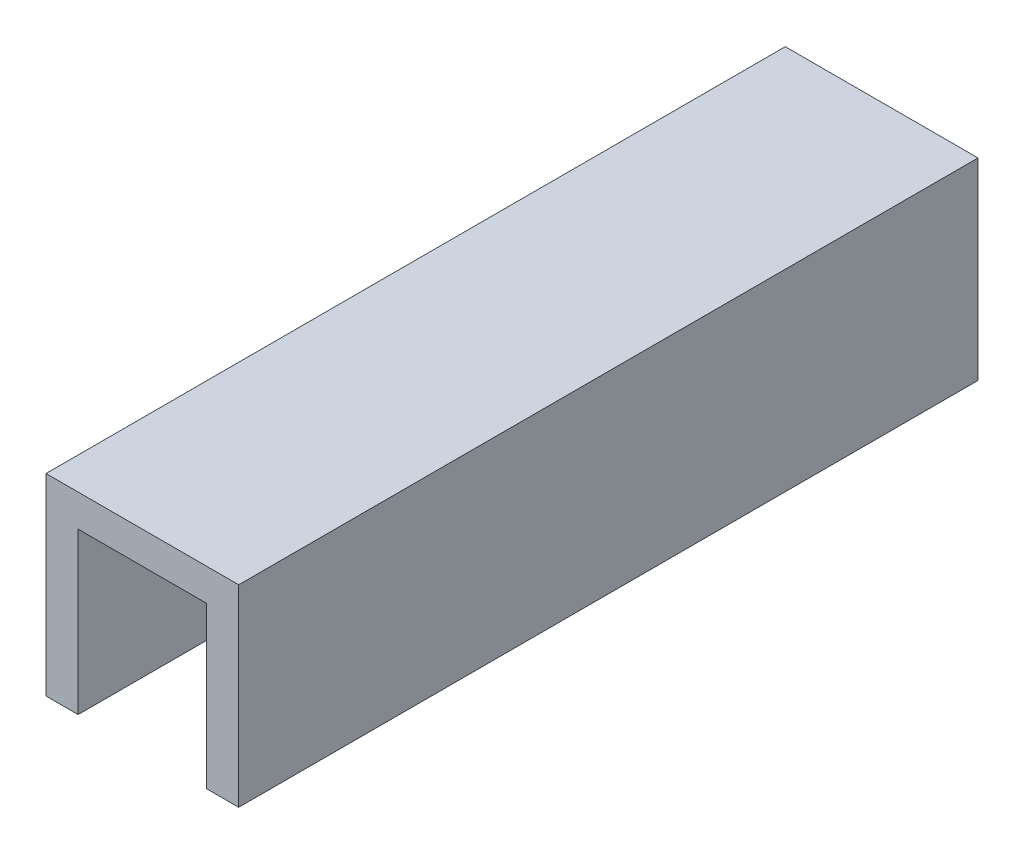
ISO-10303-21;
HEADER;
FILE_DESCRIPTION(('STEP AP214'),'2;1');
FILE_NAME('part.step','',(''),(''),'','','');
FILE_SCHEMA(('AUTOMOTIVE_DESIGN { 1 0 10303 214 1 1 1 1 }'));
ENDSEC;
DATA;
#1=APPLICATION_CONTEXT('core data for automotive mechanical design processes');
#2=APPLICATION_PROTOCOL_DEFINITION('international standard','automotive_design',2000,#1);
#3=PRODUCT_CONTEXT('',#1,'mechanical');
#4=PRODUCT('Part','Part','',(#3));
#5=PRODUCT_RELATED_PRODUCT_CATEGORY('part','',(#4));
#6=PRODUCT_DEFINITION_FORMATION('','',#4);
#7=PRODUCT_DEFINITION_CONTEXT('part definition',#1,'design');
#8=PRODUCT_DEFINITION('design','',#6,#7);
#9=PRODUCT_DEFINITION_SHAPE('','',#8);
#10=(LENGTH_UNIT() NAMED_UNIT(*) SI_UNIT(.MILLI.,.METRE.));
#11=(NAMED_UNIT(*) PLANE_ANGLE_UNIT() SI_UNIT($,.RADIAN.));
#12=(NAMED_UNIT(*) SI_UNIT($,.STERADIAN.) SOLID_ANGLE_UNIT());
#13=UNCERTAINTY_MEASURE_WITH_UNIT(LENGTH_MEASURE(1.E-05),#10,'distance_accuracy_value','');
#14=(GEOMETRIC_REPRESENTATION_CONTEXT(3) GLOBAL_UNCERTAINTY_ASSIGNED_CONTEXT((#13)) GLOBAL_UNIT_ASSIGNED_CONTEXT((#10,
#11,#12)) REPRESENTATION_CONTEXT('',''));
#15=CARTESIAN_POINT('',(0.,0.,0.));
#16=DIRECTION('',(0.,0.,1.));
#17=DIRECTION('',(1.,0.,0.));
#18=AXIS2_PLACEMENT_3D('',#15,#16,#17);
#19=CARTESIAN_POINT('',(0.,0.,0.));
#20=DIRECTION('',(0.,0.,-1.));
#21=DIRECTION('',(-1.,0.,0.));
#22=AXIS2_PLACEMENT_3D('',#19,#20,#21);
#23=PLANE('',#22);
#24=DIRECTION('',(0.,1.,0.));
#25=VECTOR('',#24,1.);
#26=CARTESIAN_POINT('',(0.,-7.9375,0.));
#27=LINE('',#26,#25);
#28=CARTESIAN_POINT('',(0.,-7.9375,0.));
#29=VERTEX_POINT('',#28);
#30=CARTESIAN_POINT('',(0.,0.,0.));
#31=VERTEX_POINT('',#30);
#32=EDGE_CURVE('E110',#29,#31,#27,.T.);
#33=ORIENTED_EDGE('',*,*,#32,.F.);
#34=DIRECTION('',(1.,0.,0.));
#35=VECTOR('',#34,1.);
#36=CARTESIAN_POINT('',(-1.5875,-7.9375,0.));
#37=LINE('',#36,#35);
#38=CARTESIAN_POINT('',(-1.5875,-7.9375,0.));
#39=VERTEX_POINT('',#38);
#40=EDGE_CURVE('E74',#39,#29,#37,.T.);
#41=ORIENTED_EDGE('',*,*,#40,.F.);
#42=DIRECTION('',(0.,-1.,0.));
#43=VECTOR('',#42,1.);
#44=CARTESIAN_POINT('',(-1.5875,1.5875,0.));
#45=LINE('',#44,#43);
#46=CARTESIAN_POINT('',(-1.5875,1.5875,0.));
#47=VERTEX_POINT('',#46);
#48=EDGE_CURVE('E80',#47,#39,#45,.T.);
#49=ORIENTED_EDGE('',*,*,#48,.F.);
#50=DIRECTION('',(-1.,0.,0.));
#51=VECTOR('',#50,1.);
#52=CARTESIAN_POINT('',(7.9375,1.5875,0.));
#53=LINE('',#52,#51);
#54=CARTESIAN_POINT('',(7.9375,1.5875,0.));
#55=VERTEX_POINT('',#54);
#56=EDGE_CURVE('E85',#55,#47,#53,.T.);
#57=ORIENTED_EDGE('',*,*,#56,.F.);
#58=DIRECTION('',(0.,1.,0.));
#59=VECTOR('',#58,1.);
#60=CARTESIAN_POINT('',(7.9375,-7.9375,0.));
#61=LINE('',#60,#59);
#62=CARTESIAN_POINT('',(7.9375,-7.9375,0.));
#63=VERTEX_POINT('',#62);
#64=EDGE_CURVE('E150',#63,#55,#61,.T.);
#65=ORIENTED_EDGE('',*,*,#64,.F.);
#66=DIRECTION('',(1.,0.,0.));
#67=VECTOR('',#66,1.);
#68=CARTESIAN_POINT('',(6.35,-7.9375,0.));
#69=LINE('',#68,#67);
#70=CARTESIAN_POINT('',(6.35,-7.9375,0.));
#71=VERTEX_POINT('',#70);
#72=EDGE_CURVE('E142',#71,#63,#69,.T.);
#73=ORIENTED_EDGE('',*,*,#72,.F.);
#74=DIRECTION('',(0.,-1.,0.));
#75=VECTOR('',#74,1.);
#76=CARTESIAN_POINT('',(6.35,0.,0.));
#77=LINE('',#76,#75);
#78=CARTESIAN_POINT('',(6.35,0.,0.));
#79=VERTEX_POINT('',#78);
#80=EDGE_CURVE('E133',#79,#71,#77,.T.);
#81=ORIENTED_EDGE('',*,*,#80,.F.);
#82=DIRECTION('',(1.,0.,0.));
#83=VECTOR('',#82,1.);
#84=CARTESIAN_POINT('',(0.,0.,0.));
#85=LINE('',#84,#83);
#86=EDGE_CURVE('E112',#31,#79,#85,.T.);
#87=ORIENTED_EDGE('',*,*,#86,.F.);
#88=EDGE_LOOP('',(#33,#41,#49,#57,#65,#73,#81,#87));
#89=FACE_BOUND('',#88,.T.);
#90=ADVANCED_FACE('F43',(#89),#23,.T.);
#91=CARTESIAN_POINT('',(0.,0.,36.5379));
#92=DIRECTION('',(0.,0.,-1.));
#93=DIRECTION('',(-1.,0.,0.));
#94=AXIS2_PLACEMENT_3D('',#91,#92,#93);
#95=PLANE('',#94);
#96=DIRECTION('',(0.,1.,0.));
#97=VECTOR('',#96,1.);
#98=CARTESIAN_POINT('',(0.,-7.93750000000001,36.5379));
#99=LINE('',#98,#97);
#100=CARTESIAN_POINT('',(0.,-7.93750000000001,36.5379));
#101=VERTEX_POINT('',#100);
#102=CARTESIAN_POINT('',(0.,0.,36.5379));
#103=VERTEX_POINT('',#102);
#104=EDGE_CURVE('E126',#101,#103,#99,.T.);
#105=ORIENTED_EDGE('',*,*,#104,.T.);
#106=DIRECTION('',(1.,0.,0.));
#107=VECTOR('',#106,1.);
#108=CARTESIAN_POINT('',(0.,0.,36.5379));
#109=LINE('',#108,#107);
#110=CARTESIAN_POINT('',(6.35,0.,36.5379));
#111=VERTEX_POINT('',#110);
#112=EDGE_CURVE('E134',#103,#111,#109,.T.);
#113=ORIENTED_EDGE('',*,*,#112,.T.);
#114=DIRECTION('',(0.,-1.,0.));
#115=VECTOR('',#114,1.);
#116=CARTESIAN_POINT('',(6.35,0.,36.5379));
#117=LINE('',#116,#115);
#118=CARTESIAN_POINT('',(6.35,-7.93750000000001,36.5379));
#119=VERTEX_POINT('',#118);
#120=EDGE_CURVE('E139',#111,#119,#117,.T.);
#121=ORIENTED_EDGE('',*,*,#120,.T.);
#122=DIRECTION('',(1.,0.,0.));
#123=VECTOR('',#122,1.);
#124=CARTESIAN_POINT('',(6.35,-7.93750000000001,36.5379));
#125=LINE('',#124,#123);
#126=CARTESIAN_POINT('',(7.9375,-7.93750000000001,36.5379));
#127=VERTEX_POINT('',#126);
#128=EDGE_CURVE('E147',#119,#127,#125,.T.);
#129=ORIENTED_EDGE('',*,*,#128,.T.);
#130=DIRECTION('',(0.,1.,0.));
#131=VECTOR('',#130,1.);
#132=CARTESIAN_POINT('',(7.9375,-7.93750000000001,36.5379));
#133=LINE('',#132,#131);
#134=CARTESIAN_POINT('',(7.9375,1.5875,36.5379));
#135=VERTEX_POINT('',#134);
#136=EDGE_CURVE('E155',#127,#135,#133,.T.);
#137=ORIENTED_EDGE('',*,*,#136,.T.);
#138=DIRECTION('',(-1.,0.,0.));
#139=VECTOR('',#138,1.);
#140=CARTESIAN_POINT('',(7.9375,1.5875,36.5379));
#141=LINE('',#140,#139);
#142=CARTESIAN_POINT('',(-1.5875,1.5875,36.5379));
#143=VERTEX_POINT('',#142);
#144=EDGE_CURVE('E62',#135,#143,#141,.T.);
#145=ORIENTED_EDGE('',*,*,#144,.T.);
#146=DIRECTION('',(0.,-1.,0.));
#147=VECTOR('',#146,1.);
#148=CARTESIAN_POINT('',(-1.5875,1.5875,36.5379));
#149=LINE('',#148,#147);
#150=CARTESIAN_POINT('',(-1.5875,-7.93750000000001,36.5379));
#151=VERTEX_POINT('',#150);
#152=EDGE_CURVE('E56',#143,#151,#149,.T.);
#153=ORIENTED_EDGE('',*,*,#152,.T.);
#154=DIRECTION('',(1.,0.,0.));
#155=VECTOR('',#154,1.);
#156=CARTESIAN_POINT('',(-1.5875,-7.93750000000001,36.5379));
#157=LINE('',#156,#155);
#158=EDGE_CURVE('E11',#151,#101,#157,.T.);
#159=ORIENTED_EDGE('',*,*,#158,.T.);
#160=EDGE_LOOP('',(#105,#113,#121,#129,#137,#145,#153,#159));
#161=FACE_BOUND('',#160,.T.);
#162=ADVANCED_FACE('F189',(#161),#95,.F.);
#163=CARTESIAN_POINT('',(0.,-7.9375,0.));
#164=DIRECTION('',(1.,0.,0.));
#165=DIRECTION('',(0.,0.,-1.));
#166=AXIS2_PLACEMENT_3D('',#163,#164,#165);
#167=PLANE('',#166);
#168=DIRECTION('',(0.,0.,1.));
#169=VECTOR('',#168,1.);
#170=CARTESIAN_POINT('',(0.,0.,0.));
#171=LINE('',#170,#169);
#172=EDGE_CURVE('E128',#31,#103,#171,.T.);
#173=ORIENTED_EDGE('',*,*,#172,.T.);
#174=ORIENTED_EDGE('',*,*,#104,.F.);
#175=DIRECTION('',(0.,0.,1.));
#176=VECTOR('',#175,1.);
#177=CARTESIAN_POINT('',(0.,-7.9375,0.));
#178=LINE('',#177,#176);
#179=EDGE_CURVE('E122',#29,#101,#178,.T.);
#180=ORIENTED_EDGE('',*,*,#179,.F.);
#181=ORIENTED_EDGE('',*,*,#32,.T.);
#182=EDGE_LOOP('',(#173,#174,#180,#181));
#183=FACE_BOUND('',#182,.T.);
#184=ADVANCED_FACE('F125',(#183),#167,.T.);
#185=CARTESIAN_POINT('',(0.,0.,0.));
#186=DIRECTION('',(0.,-1.,0.));
#187=DIRECTION('',(0.,0.,-1.));
#188=AXIS2_PLACEMENT_3D('',#185,#186,#187);
#189=PLANE('',#188);
#190=DIRECTION('',(0.,0.,1.));
#191=VECTOR('',#190,1.);
#192=CARTESIAN_POINT('',(6.35,0.,0.));
#193=LINE('',#192,#191);
#194=EDGE_CURVE('E136',#79,#111,#193,.T.);
#195=ORIENTED_EDGE('',*,*,#194,.T.);
#196=ORIENTED_EDGE('',*,*,#112,.F.);
#197=ORIENTED_EDGE('',*,*,#172,.F.);
#198=ORIENTED_EDGE('',*,*,#86,.T.);
#199=EDGE_LOOP('',(#195,#196,#197,#198));
#200=FACE_BOUND('',#199,.T.);
#201=ADVANCED_FACE('F187',(#200),#189,.T.);
#202=CARTESIAN_POINT('',(6.35,0.,0.));
#203=DIRECTION('',(-1.,0.,0.));
#204=DIRECTION('',(0.,-1.,0.));
#205=AXIS2_PLACEMENT_3D('',#202,#203,#204);
#206=PLANE('',#205);
#207=DIRECTION('',(0.,0.,1.));
#208=VECTOR('',#207,1.);
#209=CARTESIAN_POINT('',(6.35,-7.9375,0.));
#210=LINE('',#209,#208);
#211=EDGE_CURVE('E144',#71,#119,#210,.T.);
#212=ORIENTED_EDGE('',*,*,#211,.T.);
#213=ORIENTED_EDGE('',*,*,#120,.F.);
#214=ORIENTED_EDGE('',*,*,#194,.F.);
#215=ORIENTED_EDGE('',*,*,#80,.T.);
#216=EDGE_LOOP('',(#212,#213,#214,#215));
#217=FACE_BOUND('',#216,.T.);
#218=ADVANCED_FACE('F184',(#217),#206,.T.);
#219=CARTESIAN_POINT('',(6.35,-7.9375,0.));
#220=DIRECTION('',(0.,-1.,0.));
#221=DIRECTION('',(0.,0.,-1.));
#222=AXIS2_PLACEMENT_3D('',#219,#220,#221);
#223=PLANE('',#222);
#224=DIRECTION('',(0.,0.,1.));
#225=VECTOR('',#224,1.);
#226=CARTESIAN_POINT('',(7.9375,-7.9375,0.));
#227=LINE('',#226,#225);
#228=EDGE_CURVE('E152',#63,#127,#227,.T.);
#229=ORIENTED_EDGE('',*,*,#228,.T.);
#230=ORIENTED_EDGE('',*,*,#128,.F.);
#231=ORIENTED_EDGE('',*,*,#211,.F.);
#232=ORIENTED_EDGE('',*,*,#72,.T.);
#233=EDGE_LOOP('',(#229,#230,#231,#232));
#234=FACE_BOUND('',#233,.T.);
#235=ADVANCED_FACE('F180',(#234),#223,.T.);
#236=CARTESIAN_POINT('',(7.9375,-7.9375,0.));
#237=DIRECTION('',(1.,0.,0.));
#238=DIRECTION('',(0.,0.,-1.));
#239=AXIS2_PLACEMENT_3D('',#236,#237,#238);
#240=PLANE('',#239);
#241=DIRECTION('',(0.,0.,1.));
#242=VECTOR('',#241,1.);
#243=CARTESIAN_POINT('',(7.9375,1.5875,0.));
#244=LINE('',#243,#242);
#245=EDGE_CURVE('E158',#55,#135,#244,.T.);
#246=ORIENTED_EDGE('',*,*,#245,.T.);
#247=ORIENTED_EDGE('',*,*,#136,.F.);
#248=ORIENTED_EDGE('',*,*,#228,.F.);
#249=ORIENTED_EDGE('',*,*,#64,.T.);
#250=EDGE_LOOP('',(#246,#247,#248,#249));
#251=FACE_BOUND('',#250,.T.);
#252=ADVANCED_FACE('F176',(#251),#240,.T.);
#253=CARTESIAN_POINT('',(7.9375,1.5875,0.));
#254=DIRECTION('',(0.,1.,0.));
#255=DIRECTION('',(0.,0.,1.));
#256=AXIS2_PLACEMENT_3D('',#253,#254,#255);
#257=PLANE('',#256);
#258=DIRECTION('',(0.,0.,1.));
#259=VECTOR('',#258,1.);
#260=CARTESIAN_POINT('',(-1.5875,1.5875,0.));
#261=LINE('',#260,#259);
#262=EDGE_CURVE('E163',#47,#143,#261,.T.);
#263=ORIENTED_EDGE('',*,*,#262,.T.);
#264=ORIENTED_EDGE('',*,*,#144,.F.);
#265=ORIENTED_EDGE('',*,*,#245,.F.);
#266=ORIENTED_EDGE('',*,*,#56,.T.);
#267=EDGE_LOOP('',(#263,#264,#265,#266));
#268=FACE_BOUND('',#267,.T.);
#269=ADVANCED_FACE('F172',(#268),#257,.T.);
#270=CARTESIAN_POINT('',(-1.5875,1.5875,0.));
#271=DIRECTION('',(-1.,0.,0.));
#272=DIRECTION('',(0.,0.,1.));
#273=AXIS2_PLACEMENT_3D('',#270,#271,#272);
#274=PLANE('',#273);
#275=DIRECTION('',(0.,0.,1.));
#276=VECTOR('',#275,1.);
#277=CARTESIAN_POINT('',(-1.5875,-7.9375,0.));
#278=LINE('',#277,#276);
#279=EDGE_CURVE('E50',#39,#151,#278,.T.);
#280=ORIENTED_EDGE('',*,*,#279,.T.);
#281=ORIENTED_EDGE('',*,*,#152,.F.);
#282=ORIENTED_EDGE('',*,*,#262,.F.);
#283=ORIENTED_EDGE('',*,*,#48,.T.);
#284=EDGE_LOOP('',(#280,#281,#282,#283));
#285=FACE_BOUND('',#284,.T.);
#286=ADVANCED_FACE('F169',(#285),#274,.T.);
#287=CARTESIAN_POINT('',(-1.5875,-7.9375,0.));
#288=DIRECTION('',(0.,-1.,0.));
#289=DIRECTION('',(0.,0.,-1.));
#290=AXIS2_PLACEMENT_3D('',#287,#288,#289);
#291=PLANE('',#290);
#292=ORIENTED_EDGE('',*,*,#158,.F.);
#293=ORIENTED_EDGE('',*,*,#279,.F.);
#294=ORIENTED_EDGE('',*,*,#40,.T.);
#295=ORIENTED_EDGE('',*,*,#179,.T.);
#296=EDGE_LOOP('',(#292,#293,#294,#295));
#297=FACE_BOUND('',#296,.T.);
#298=ADVANCED_FACE('F121',(#297),#291,.T.);
#299=CLOSED_SHELL('',(#90,#162,#184,#201,#218,#235,#252,#269,#286,#298));
#300=MANIFOLD_SOLID_BREP('B2',#299);
#301=ADVANCED_BREP_SHAPE_REPRESENTATION('',(#18,#300),#14);
#302=SHAPE_DEFINITION_REPRESENTATION(#9,#301);
ENDSEC;
END-ISO-10303-21;
